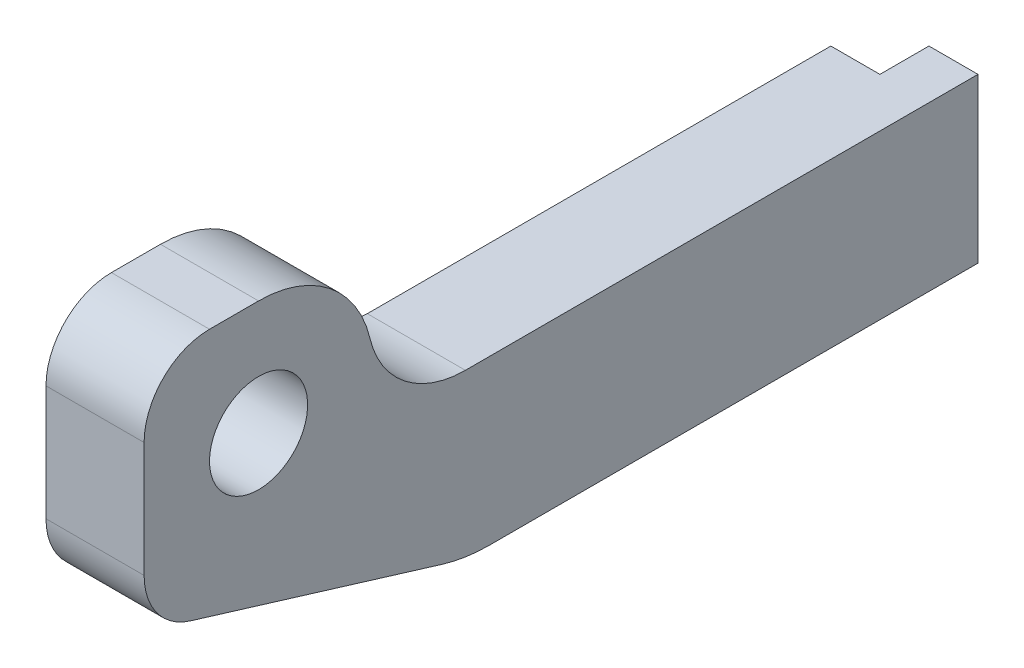
ISO-10303-21;
HEADER;
FILE_DESCRIPTION(('STEP AP214'),'2;1');
FILE_NAME('part.step','',(''),(''),'','','');
FILE_SCHEMA(('AUTOMOTIVE_DESIGN { 1 0 10303 214 1 1 1 1 }'));
ENDSEC;
DATA;
#1=APPLICATION_CONTEXT('core data for automotive mechanical design processes');
#2=APPLICATION_PROTOCOL_DEFINITION('international standard','automotive_design',2000,#1);
#3=PRODUCT_CONTEXT('',#1,'mechanical');
#4=PRODUCT('Part','Part','',(#3));
#5=PRODUCT_RELATED_PRODUCT_CATEGORY('part','',(#4));
#6=PRODUCT_DEFINITION_FORMATION('','',#4);
#7=PRODUCT_DEFINITION_CONTEXT('part definition',#1,'design');
#8=PRODUCT_DEFINITION('design','',#6,#7);
#9=PRODUCT_DEFINITION_SHAPE('','',#8);
#10=(LENGTH_UNIT() NAMED_UNIT(*) SI_UNIT(.MILLI.,.METRE.));
#11=(NAMED_UNIT(*) PLANE_ANGLE_UNIT() SI_UNIT($,.RADIAN.));
#12=(NAMED_UNIT(*) SI_UNIT($,.STERADIAN.) SOLID_ANGLE_UNIT());
#13=UNCERTAINTY_MEASURE_WITH_UNIT(LENGTH_MEASURE(1.E-05),#10,'distance_accuracy_value','');
#14=(GEOMETRIC_REPRESENTATION_CONTEXT(3) GLOBAL_UNCERTAINTY_ASSIGNED_CONTEXT((#13)) GLOBAL_UNIT_ASSIGNED_CONTEXT((#10,
#11,#12)) REPRESENTATION_CONTEXT('',''));
#15=CARTESIAN_POINT('',(0.,0.,0.));
#16=DIRECTION('',(0.,0.,1.));
#17=DIRECTION('',(1.,0.,0.));
#18=AXIS2_PLACEMENT_3D('',#15,#16,#17);
#19=CARTESIAN_POINT('',(-4.,111.5,-23.8150000000001));
#20=DIRECTION('',(-1.,0.,0.));
#21=DIRECTION('',(0.,0.,1.));
#22=AXIS2_PLACEMENT_3D('',#19,#20,#21);
#23=PLANE('',#22);
#24=DIRECTION('',(0.,0.,1.));
#25=VECTOR('',#24,1.);
#26=CARTESIAN_POINT('',(-4.,111.5,-23.8150000000001));
#27=LINE('',#26,#25);
#28=CARTESIAN_POINT('',(-4.,111.5,-23.8150000000001));
#29=VERTEX_POINT('',#28);
#30=CARTESIAN_POINT('',(-4.,111.5,-10.3859376049756));
#31=VERTEX_POINT('',#30);
#32=EDGE_CURVE('E183',#29,#31,#27,.T.);
#33=ORIENTED_EDGE('',*,*,#32,.T.);
#34=CARTESIAN_POINT('',(-4.,116.5,-10.3859376049756));
#35=DIRECTION('',(-1.,0.,0.));
#36=DIRECTION('',(0.,0.,1.));
#37=AXIS2_PLACEMENT_3D('',#34,#35,#36);
#38=CIRCLE('',#37,5.);
#39=CARTESIAN_POINT('',(-4.,111.717977316976,-8.92571191726682));
#40=VERTEX_POINT('',#39);
#41=EDGE_CURVE('E11',#31,#40,#38,.T.);
#42=ORIENTED_EDGE('',*,*,#41,.T.);
#43=DIRECTION('',(0.,0.292045137541756,0.956404536604787));
#44=VECTOR('',#43,1.);
#45=CARTESIAN_POINT('',(-4.,111.5,-9.63955532033681));
#46=LINE('',#45,#44);
#47=CARTESIAN_POINT('',(-4.,114.067641584148,-1.23090972491653));
#48=VERTEX_POINT('',#47);
#49=EDGE_CURVE('E253',#40,#48,#46,.T.);
#50=ORIENTED_EDGE('',*,*,#49,.T.);
#51=CARTESIAN_POINT('',(-4.,115.980450657358,-1.81500000000004));
#52=DIRECTION('',(-1.,0.,0.));
#53=DIRECTION('',(0.,0.,1.));
#54=AXIS2_PLACEMENT_3D('',#51,#52,#53);
#55=CIRCLE('',#54,2.);
#56=CARTESIAN_POINT('',(-4.,115.980450657358,0.184999999999962));
#57=VERTEX_POINT('',#56);
#58=EDGE_CURVE('E145',#48,#57,#55,.T.);
#59=ORIENTED_EDGE('',*,*,#58,.T.);
#60=DIRECTION('',(0.,1.,0.));
#61=VECTOR('',#60,1.);
#62=CARTESIAN_POINT('',(-4.,115.980450657358,0.18499999999996));
#63=LINE('',#62,#61);
#64=CARTESIAN_POINT('',(-4.,119.5,0.18499999999996));
#65=VERTEX_POINT('',#64);
#66=EDGE_CURVE('E249',#57,#65,#63,.T.);
#67=ORIENTED_EDGE('',*,*,#66,.T.);
#68=CARTESIAN_POINT('',(-4.,119.5,-1.81500000000004));
#69=DIRECTION('',(-1.,0.,0.));
#70=DIRECTION('',(0.,0.,1.));
#71=AXIS2_PLACEMENT_3D('',#68,#69,#70);
#72=CIRCLE('',#71,2.);
#73=CARTESIAN_POINT('',(-4.,121.5,-1.81500000000004));
#74=VERTEX_POINT('',#73);
#75=EDGE_CURVE('E246',#65,#74,#72,.T.);
#76=ORIENTED_EDGE('',*,*,#75,.T.);
#77=DIRECTION('',(0.,0.,-1.));
#78=VECTOR('',#77,1.);
#79=CARTESIAN_POINT('',(-4.,121.5,-1.81500000000004));
#80=LINE('',#79,#78);
#81=CARTESIAN_POINT('',(-4.,121.5,-3.31500000000004));
#82=VERTEX_POINT('',#81);
#83=EDGE_CURVE('E242',#74,#82,#80,.T.);
#84=ORIENTED_EDGE('',*,*,#83,.T.);
#85=CARTESIAN_POINT('',(-4.,118.,-3.31500000000004));
#86=DIRECTION('',(-1.,0.,0.));
#87=DIRECTION('',(0.,0.,1.));
#88=AXIS2_PLACEMENT_3D('',#85,#86,#87);
#89=CIRCLE('',#88,3.5);
#90=CARTESIAN_POINT('',(-4.,118.807692307692,-6.72052978787368));
#91=VERTEX_POINT('',#90);
#92=EDGE_CURVE('E240',#82,#91,#89,.T.);
#93=ORIENTED_EDGE('',*,*,#92,.T.);
#94=CARTESIAN_POINT('',(-4.,119.5,-9.6395553203368));
#95=DIRECTION('',(-1.,0.,0.));
#96=DIRECTION('',(0.,0.,1.));
#97=AXIS2_PLACEMENT_3D('',#94,#95,#96);
#98=CIRCLE('',#97,3.);
#99=CARTESIAN_POINT('',(-4.,116.5,-9.6395553203368));
#100=VERTEX_POINT('',#99);
#101=EDGE_CURVE('E182',#91,#100,#98,.F.);
#102=ORIENTED_EDGE('',*,*,#101,.T.);
#103=DIRECTION('',(0.,0.,1.));
#104=VECTOR('',#103,1.);
#105=CARTESIAN_POINT('',(-4.,116.5,-23.8150000000001));
#106=LINE('',#105,#104);
#107=CARTESIAN_POINT('',(-4.,116.5,-23.8150000000001));
#108=VERTEX_POINT('',#107);
#109=EDGE_CURVE('E146',#108,#100,#106,.T.);
#110=ORIENTED_EDGE('',*,*,#109,.F.);
#111=DIRECTION('',(0.,1.,0.));
#112=VECTOR('',#111,1.);
#113=CARTESIAN_POINT('',(-4.,111.5,-23.8150000000001));
#114=LINE('',#113,#112);
#115=EDGE_CURVE('E212',#29,#108,#114,.T.);
#116=ORIENTED_EDGE('',*,*,#115,.F.);
#117=EDGE_LOOP('',(#33,#42,#50,#59,#67,#76,#84,#93,#102,#110,#116));
#118=FACE_BOUND('',#117,.T.);
#119=CARTESIAN_POINT('',(-4.,118.,-3.31500000000004));
#120=DIRECTION('',(-1.,0.,0.));
#121=DIRECTION('',(0.,0.,1.));
#122=AXIS2_PLACEMENT_3D('',#119,#120,#121);
#123=CIRCLE('',#122,1.5);
#124=CARTESIAN_POINT('',(-4.,118.,-1.81500000000004));
#125=VERTEX_POINT('',#124);
#126=EDGE_CURVE('E179',#125,#125,#123,.T.);
#127=ORIENTED_EDGE('',*,*,#126,.F.);
#128=EDGE_LOOP('',(#127));
#129=FACE_BOUND('',#128,.T.);
#130=ADVANCED_FACE('F33',(#118,#129),#23,.T.);
#131=CARTESIAN_POINT('',(-4.,111.5,-23.8150000000001));
#132=DIRECTION('',(0.,0.,-1.));
#133=DIRECTION('',(0.,1.,0.));
#134=AXIS2_PLACEMENT_3D('',#131,#132,#133);
#135=PLANE('',#134);
#136=DIRECTION('',(-1.,0.,0.));
#137=VECTOR('',#136,1.);
#138=CARTESIAN_POINT('',(-4.,116.5,-23.8150000000001));
#139=LINE('',#138,#137);
#140=CARTESIAN_POINT('',(-2.5,116.5,-23.8150000000001));
#141=VERTEX_POINT('',#140);
#142=EDGE_CURVE('E186',#141,#108,#139,.T.);
#143=ORIENTED_EDGE('',*,*,#142,.F.);
#144=DIRECTION('',(0.,1.,0.));
#145=VECTOR('',#144,1.);
#146=CARTESIAN_POINT('',(-2.5,111.5,-23.8150000000001));
#147=LINE('',#146,#145);
#148=CARTESIAN_POINT('',(-2.5,111.5,-23.8150000000001));
#149=VERTEX_POINT('',#148);
#150=EDGE_CURVE('E214',#149,#141,#147,.T.);
#151=ORIENTED_EDGE('',*,*,#150,.F.);
#152=DIRECTION('',(-1.,0.,0.));
#153=VECTOR('',#152,1.);
#154=CARTESIAN_POINT('',(-4.,111.5,-23.8150000000001));
#155=LINE('',#154,#153);
#156=EDGE_CURVE('E194',#149,#29,#155,.T.);
#157=ORIENTED_EDGE('',*,*,#156,.T.);
#158=ORIENTED_EDGE('',*,*,#115,.T.);
#159=EDGE_LOOP('',(#143,#151,#157,#158));
#160=FACE_BOUND('',#159,.T.);
#161=ADVANCED_FACE('F263',(#160),#135,.T.);
#162=CARTESIAN_POINT('',(-2.5,111.5,-23.8150000000001));
#163=DIRECTION('',(-1.,0.,0.));
#164=DIRECTION('',(0.,0.,1.));
#165=AXIS2_PLACEMENT_3D('',#162,#163,#164);
#166=PLANE('',#165);
#167=DIRECTION('',(0.,0.,1.));
#168=VECTOR('',#167,1.);
#169=CARTESIAN_POINT('',(-2.5,116.5,-23.8150000000001));
#170=LINE('',#169,#168);
#171=CARTESIAN_POINT('',(-2.5,116.5,-25.3150000000001));
#172=VERTEX_POINT('',#171);
#173=EDGE_CURVE('E207',#172,#141,#170,.T.);
#174=ORIENTED_EDGE('',*,*,#173,.F.);
#175=DIRECTION('',(0.,1.,0.));
#176=VECTOR('',#175,1.);
#177=CARTESIAN_POINT('',(-2.5,111.5,-25.3150000000001));
#178=LINE('',#177,#176);
#179=CARTESIAN_POINT('',(-2.5,111.5,-25.3150000000001));
#180=VERTEX_POINT('',#179);
#181=EDGE_CURVE('E216',#180,#172,#178,.T.);
#182=ORIENTED_EDGE('',*,*,#181,.F.);
#183=DIRECTION('',(0.,0.,1.));
#184=VECTOR('',#183,1.);
#185=CARTESIAN_POINT('',(-2.5,111.5,-23.8150000000001));
#186=LINE('',#185,#184);
#187=EDGE_CURVE('E191',#180,#149,#186,.T.);
#188=ORIENTED_EDGE('',*,*,#187,.T.);
#189=ORIENTED_EDGE('',*,*,#150,.T.);
#190=EDGE_LOOP('',(#174,#182,#188,#189));
#191=FACE_BOUND('',#190,.T.);
#192=ADVANCED_FACE('F267',(#191),#166,.T.);
#193=CARTESIAN_POINT('',(-2.5,111.5,-25.3150000000001));
#194=DIRECTION('',(0.,0.,-1.));
#195=DIRECTION('',(0.,1.,0.));
#196=AXIS2_PLACEMENT_3D('',#193,#194,#195);
#197=PLANE('',#196);
#198=DIRECTION('',(-1.,0.,0.));
#199=VECTOR('',#198,1.);
#200=CARTESIAN_POINT('',(-2.5,116.5,-25.3150000000001));
#201=LINE('',#200,#199);
#202=CARTESIAN_POINT('',(-1.,116.5,-25.3150000000001));
#203=VERTEX_POINT('',#202);
#204=EDGE_CURVE('E204',#203,#172,#201,.T.);
#205=ORIENTED_EDGE('',*,*,#204,.F.);
#206=DIRECTION('',(0.,1.,0.));
#207=VECTOR('',#206,1.);
#208=CARTESIAN_POINT('',(-1.,111.5,-25.3150000000001));
#209=LINE('',#208,#207);
#210=CARTESIAN_POINT('',(-1.,111.5,-25.3150000000001));
#211=VERTEX_POINT('',#210);
#212=EDGE_CURVE('E197',#211,#203,#209,.T.);
#213=ORIENTED_EDGE('',*,*,#212,.F.);
#214=DIRECTION('',(-1.,0.,0.));
#215=VECTOR('',#214,1.);
#216=CARTESIAN_POINT('',(-2.5,111.5,-25.3150000000001));
#217=LINE('',#216,#215);
#218=EDGE_CURVE('E188',#211,#180,#217,.T.);
#219=ORIENTED_EDGE('',*,*,#218,.T.);
#220=ORIENTED_EDGE('',*,*,#181,.T.);
#221=EDGE_LOOP('',(#205,#213,#219,#220));
#222=FACE_BOUND('',#221,.T.);
#223=ADVANCED_FACE('F226',(#222),#197,.T.);
#224=CARTESIAN_POINT('',(-1.,111.5,-25.3150000000001));
#225=DIRECTION('',(1.,0.,0.));
#226=DIRECTION('',(0.,0.,-1.));
#227=AXIS2_PLACEMENT_3D('',#224,#225,#226);
#228=PLANE('',#227);
#229=DIRECTION('',(0.,0.292045137541756,0.956404536604787));
#230=VECTOR('',#229,1.);
#231=CARTESIAN_POINT('',(-1.,111.5,-9.6395553203368));
#232=LINE('',#231,#230);
#233=CARTESIAN_POINT('',(-1.,111.717977316976,-8.92571191726682));
#234=VERTEX_POINT('',#233);
#235=CARTESIAN_POINT('',(-1.,114.067641584148,-1.23090972491653));
#236=VERTEX_POINT('',#235);
#237=EDGE_CURVE('E127',#234,#236,#232,.T.);
#238=ORIENTED_EDGE('',*,*,#237,.F.);
#239=CARTESIAN_POINT('',(-1.,116.5,-10.3859376049756));
#240=DIRECTION('',(1.,0.,0.));
#241=DIRECTION('',(0.,0.,-1.));
#242=AXIS2_PLACEMENT_3D('',#239,#240,#241);
#243=CIRCLE('',#242,5.);
#244=CARTESIAN_POINT('',(-1.,111.5,-10.3859376049756));
#245=VERTEX_POINT('',#244);
#246=EDGE_CURVE('E55',#234,#245,#243,.T.);
#247=ORIENTED_EDGE('',*,*,#246,.T.);
#248=DIRECTION('',(0.,0.,-1.));
#249=VECTOR('',#248,1.);
#250=CARTESIAN_POINT('',(-1.,111.5,-25.3150000000001));
#251=LINE('',#250,#249);
#252=EDGE_CURVE('E185',#245,#211,#251,.T.);
#253=ORIENTED_EDGE('',*,*,#252,.T.);
#254=ORIENTED_EDGE('',*,*,#212,.T.);
#255=DIRECTION('',(0.,0.,-1.));
#256=VECTOR('',#255,1.);
#257=CARTESIAN_POINT('',(-1.,116.5,-25.3150000000001));
#258=LINE('',#257,#256);
#259=CARTESIAN_POINT('',(-1.,116.5,-9.6395553203368));
#260=VERTEX_POINT('',#259);
#261=EDGE_CURVE('E201',#260,#203,#258,.T.);
#262=ORIENTED_EDGE('',*,*,#261,.F.);
#263=CARTESIAN_POINT('',(-1.,119.5,-9.6395553203368));
#264=DIRECTION('',(1.,0.,0.));
#265=DIRECTION('',(0.,0.,1.));
#266=AXIS2_PLACEMENT_3D('',#263,#264,#265);
#267=CIRCLE('',#266,3.);
#268=CARTESIAN_POINT('',(-1.,118.807692307692,-6.72052978787368));
#269=VERTEX_POINT('',#268);
#270=EDGE_CURVE('E167',#269,#260,#267,.T.);
#271=ORIENTED_EDGE('',*,*,#270,.F.);
#272=CARTESIAN_POINT('',(-1.,118.,-3.31500000000004));
#273=DIRECTION('',(-1.,0.,0.));
#274=DIRECTION('',(0.,0.,1.));
#275=AXIS2_PLACEMENT_3D('',#272,#273,#274);
#276=CIRCLE('',#275,3.5);
#277=CARTESIAN_POINT('',(-1.,121.5,-3.31500000000004));
#278=VERTEX_POINT('',#277);
#279=EDGE_CURVE('E164',#278,#269,#276,.T.);
#280=ORIENTED_EDGE('',*,*,#279,.F.);
#281=DIRECTION('',(0.,0.,-1.));
#282=VECTOR('',#281,1.);
#283=CARTESIAN_POINT('',(-1.,121.5,-1.81500000000004));
#284=LINE('',#283,#282);
#285=CARTESIAN_POINT('',(-1.,121.5,-1.81500000000004));
#286=VERTEX_POINT('',#285);
#287=EDGE_CURVE('E161',#286,#278,#284,.T.);
#288=ORIENTED_EDGE('',*,*,#287,.F.);
#289=CARTESIAN_POINT('',(-1.,119.5,-1.81500000000004));
#290=DIRECTION('',(-1.,0.,0.));
#291=DIRECTION('',(0.,0.,1.));
#292=AXIS2_PLACEMENT_3D('',#289,#290,#291);
#293=CIRCLE('',#292,2.);
#294=CARTESIAN_POINT('',(-1.,119.5,0.18499999999996));
#295=VERTEX_POINT('',#294);
#296=EDGE_CURVE('E155',#295,#286,#293,.T.);
#297=ORIENTED_EDGE('',*,*,#296,.F.);
#298=DIRECTION('',(0.,1.,0.));
#299=VECTOR('',#298,1.);
#300=CARTESIAN_POINT('',(-1.,115.980450657358,0.18499999999996));
#301=LINE('',#300,#299);
#302=CARTESIAN_POINT('',(-1.,115.980450657358,0.184999999999962));
#303=VERTEX_POINT('',#302);
#304=EDGE_CURVE('E153',#303,#295,#301,.T.);
#305=ORIENTED_EDGE('',*,*,#304,.F.);
#306=CARTESIAN_POINT('',(-1.,115.980450657358,-1.81500000000004));
#307=DIRECTION('',(-1.,0.,0.));
#308=DIRECTION('',(0.,0.,1.));
#309=AXIS2_PLACEMENT_3D('',#306,#307,#308);
#310=CIRCLE('',#309,2.);
#311=EDGE_CURVE('E135',#236,#303,#310,.T.);
#312=ORIENTED_EDGE('',*,*,#311,.F.);
#313=EDGE_LOOP('',(#238,#247,#253,#254,#262,#271,#280,#288,#297,#305,#312));
#314=FACE_BOUND('',#313,.T.);
#315=CARTESIAN_POINT('',(-1.,118.,-3.31500000000004));
#316=DIRECTION('',(-1.,0.,0.));
#317=DIRECTION('',(0.,0.,1.));
#318=AXIS2_PLACEMENT_3D('',#315,#316,#317);
#319=CIRCLE('',#318,1.5);
#320=CARTESIAN_POINT('',(-1.,118.,-1.81500000000004));
#321=VERTEX_POINT('',#320);
#322=EDGE_CURVE('E136',#321,#321,#319,.T.);
#323=ORIENTED_EDGE('',*,*,#322,.T.);
#324=EDGE_LOOP('',(#323));
#325=FACE_BOUND('',#324,.T.);
#326=ADVANCED_FACE('F149',(#314,#325),#228,.T.);
#327=CARTESIAN_POINT('',(0.,111.5,0.));
#328=DIRECTION('',(0.,1.,0.));
#329=DIRECTION('',(0.,0.,1.));
#330=AXIS2_PLACEMENT_3D('',#327,#328,#329);
#331=PLANE('',#330);
#332=ORIENTED_EDGE('',*,*,#252,.F.);
#333=DIRECTION('',(1.,0.,0.));
#334=VECTOR('',#333,1.);
#335=CARTESIAN_POINT('',(0.,111.5,-10.3859376049756));
#336=LINE('',#335,#334);
#337=EDGE_CURVE('E41',#245,#31,#336,.F.);
#338=ORIENTED_EDGE('',*,*,#337,.T.);
#339=ORIENTED_EDGE('',*,*,#32,.F.);
#340=ORIENTED_EDGE('',*,*,#156,.F.);
#341=ORIENTED_EDGE('',*,*,#187,.F.);
#342=ORIENTED_EDGE('',*,*,#218,.F.);
#343=EDGE_LOOP('',(#332,#338,#339,#340,#341,#342));
#344=FACE_BOUND('',#343,.T.);
#345=ADVANCED_FACE('F273',(#344),#331,.F.);
#346=CARTESIAN_POINT('',(0.,116.5,0.));
#347=DIRECTION('',(0.,1.,0.));
#348=DIRECTION('',(0.,0.,1.));
#349=AXIS2_PLACEMENT_3D('',#346,#347,#348);
#350=PLANE('',#349);
#351=ORIENTED_EDGE('',*,*,#109,.T.);
#352=DIRECTION('',(1.,0.,0.));
#353=VECTOR('',#352,1.);
#354=CARTESIAN_POINT('',(-4.,116.5,-9.6395553203368));
#355=LINE('',#354,#353);
#356=EDGE_CURVE('E199',#100,#260,#355,.T.);
#357=ORIENTED_EDGE('',*,*,#356,.T.);
#358=ORIENTED_EDGE('',*,*,#261,.T.);
#359=ORIENTED_EDGE('',*,*,#204,.T.);
#360=ORIENTED_EDGE('',*,*,#173,.T.);
#361=ORIENTED_EDGE('',*,*,#142,.T.);
#362=EDGE_LOOP('',(#351,#357,#358,#359,#360,#361));
#363=FACE_BOUND('',#362,.T.);
#364=ADVANCED_FACE('F229',(#363),#350,.T.);
#365=CARTESIAN_POINT('',(-18.0186264392185,119.5,-9.6395553203368));
#366=DIRECTION('',(1.,0.,0.));
#367=DIRECTION('',(0.,0.,-1.));
#368=AXIS2_PLACEMENT_3D('',#365,#366,#367);
#369=CYLINDRICAL_SURFACE('',#368,3.);
#370=ORIENTED_EDGE('',*,*,#101,.F.);
#371=DIRECTION('',(1.,0.,0.));
#372=VECTOR('',#371,1.);
#373=CARTESIAN_POINT('',(-18.0186264392185,118.807692307692,-6.72052978787368));
#374=LINE('',#373,#372);
#375=EDGE_CURVE('E170',#91,#269,#374,.T.);
#376=ORIENTED_EDGE('',*,*,#375,.T.);
#377=ORIENTED_EDGE('',*,*,#270,.T.);
#378=ORIENTED_EDGE('',*,*,#356,.F.);
#379=EDGE_LOOP('',(#370,#376,#377,#378));
#380=FACE_BOUND('',#379,.T.);
#381=ADVANCED_FACE('F235',(#380),#369,.F.);
#382=CARTESIAN_POINT('',(-18.0186264392185,118.,-3.31500000000004));
#383=DIRECTION('',(1.,0.,0.));
#384=DIRECTION('',(0.,0.,-1.));
#385=AXIS2_PLACEMENT_3D('',#382,#383,#384);
#386=CYLINDRICAL_SURFACE('',#385,3.5);
#387=ORIENTED_EDGE('',*,*,#92,.F.);
#388=DIRECTION('',(1.,0.,0.));
#389=VECTOR('',#388,1.);
#390=CARTESIAN_POINT('',(-18.0186264392185,121.5,-3.31500000000004));
#391=LINE('',#390,#389);
#392=EDGE_CURVE('E172',#82,#278,#391,.T.);
#393=ORIENTED_EDGE('',*,*,#392,.T.);
#394=ORIENTED_EDGE('',*,*,#279,.T.);
#395=ORIENTED_EDGE('',*,*,#375,.F.);
#396=EDGE_LOOP('',(#387,#393,#394,#395));
#397=FACE_BOUND('',#396,.T.);
#398=ADVANCED_FACE('F298',(#397),#386,.T.);
#399=CARTESIAN_POINT('',(-18.0186264392185,121.5,-1.81500000000004));
#400=DIRECTION('',(0.,-1.,0.));
#401=DIRECTION('',(0.,0.,-1.));
#402=AXIS2_PLACEMENT_3D('',#399,#400,#401);
#403=PLANE('',#402);
#404=ORIENTED_EDGE('',*,*,#83,.F.);
#405=DIRECTION('',(1.,0.,0.));
#406=VECTOR('',#405,1.);
#407=CARTESIAN_POINT('',(-18.0186264392185,121.5,-1.81500000000004));
#408=LINE('',#407,#406);
#409=EDGE_CURVE('E174',#74,#286,#408,.T.);
#410=ORIENTED_EDGE('',*,*,#409,.T.);
#411=ORIENTED_EDGE('',*,*,#287,.T.);
#412=ORIENTED_EDGE('',*,*,#392,.F.);
#413=EDGE_LOOP('',(#404,#410,#411,#412));
#414=FACE_BOUND('',#413,.T.);
#415=ADVANCED_FACE('F294',(#414),#403,.F.);
#416=CARTESIAN_POINT('',(-18.0186264392185,119.5,-1.81500000000004));
#417=DIRECTION('',(1.,0.,0.));
#418=DIRECTION('',(0.,0.,-1.));
#419=AXIS2_PLACEMENT_3D('',#416,#417,#418);
#420=CYLINDRICAL_SURFACE('',#419,2.);
#421=ORIENTED_EDGE('',*,*,#75,.F.);
#422=DIRECTION('',(1.,0.,0.));
#423=VECTOR('',#422,1.);
#424=CARTESIAN_POINT('',(-18.0186264392185,119.5,0.18499999999996));
#425=LINE('',#424,#423);
#426=EDGE_CURVE('E176',#65,#295,#425,.T.);
#427=ORIENTED_EDGE('',*,*,#426,.T.);
#428=ORIENTED_EDGE('',*,*,#296,.T.);
#429=ORIENTED_EDGE('',*,*,#409,.F.);
#430=EDGE_LOOP('',(#421,#427,#428,#429));
#431=FACE_BOUND('',#430,.T.);
#432=ADVANCED_FACE('F290',(#431),#420,.T.);
#433=CARTESIAN_POINT('',(-18.0186264392185,115.980450657358,0.18499999999996));
#434=DIRECTION('',(0.,0.,-1.));
#435=DIRECTION('',(-1.,0.,0.));
#436=AXIS2_PLACEMENT_3D('',#433,#434,#435);
#437=PLANE('',#436);
#438=ORIENTED_EDGE('',*,*,#66,.F.);
#439=DIRECTION('',(1.,0.,0.));
#440=VECTOR('',#439,1.);
#441=CARTESIAN_POINT('',(-18.0186264392185,115.980450657358,0.184999999999962));
#442=LINE('',#441,#440);
#443=EDGE_CURVE('E147',#57,#303,#442,.T.);
#444=ORIENTED_EDGE('',*,*,#443,.T.);
#445=ORIENTED_EDGE('',*,*,#304,.T.);
#446=ORIENTED_EDGE('',*,*,#426,.F.);
#447=EDGE_LOOP('',(#438,#444,#445,#446));
#448=FACE_BOUND('',#447,.T.);
#449=ADVANCED_FACE('F287',(#448),#437,.F.);
#450=CARTESIAN_POINT('',(-18.0186264392185,115.980450657358,-1.81500000000004));
#451=DIRECTION('',(1.,0.,0.));
#452=DIRECTION('',(0.,0.,-1.));
#453=AXIS2_PLACEMENT_3D('',#450,#451,#452);
#454=CYLINDRICAL_SURFACE('',#453,2.);
#455=ORIENTED_EDGE('',*,*,#58,.F.);
#456=DIRECTION('',(1.,0.,0.));
#457=VECTOR('',#456,1.);
#458=CARTESIAN_POINT('',(-18.0186264392185,114.067641584148,-1.23090972491653));
#459=LINE('',#458,#457);
#460=EDGE_CURVE('E131',#48,#236,#459,.T.);
#461=ORIENTED_EDGE('',*,*,#460,.T.);
#462=ORIENTED_EDGE('',*,*,#311,.T.);
#463=ORIENTED_EDGE('',*,*,#443,.F.);
#464=EDGE_LOOP('',(#455,#461,#462,#463));
#465=FACE_BOUND('',#464,.T.);
#466=ADVANCED_FACE('F141',(#465),#454,.T.);
#467=CARTESIAN_POINT('',(-18.0186264392185,111.5,-9.6395553203368));
#468=DIRECTION('',(0.,0.956404536604787,-0.292045137541756));
#469=DIRECTION('',(0.,0.292045137541756,0.956404536604787));
#470=AXIS2_PLACEMENT_3D('',#467,#468,#469);
#471=PLANE('',#470);
#472=ORIENTED_EDGE('',*,*,#49,.F.);
#473=DIRECTION('',(1.,0.,0.));
#474=VECTOR('',#473,1.);
#475=CARTESIAN_POINT('',(-18.0186264392185,111.717977316976,-8.92571191726682));
#476=LINE('',#475,#474);
#477=EDGE_CURVE('E133',#40,#234,#476,.T.);
#478=ORIENTED_EDGE('',*,*,#477,.T.);
#479=ORIENTED_EDGE('',*,*,#237,.T.);
#480=ORIENTED_EDGE('',*,*,#460,.F.);
#481=EDGE_LOOP('',(#472,#478,#479,#480));
#482=FACE_BOUND('',#481,.T.);
#483=ADVANCED_FACE('F130',(#482),#471,.F.);
#484=CARTESIAN_POINT('',(-18.0186264392185,118.,-3.31500000000004));
#485=DIRECTION('',(1.,0.,0.));
#486=DIRECTION('',(0.,0.,-1.));
#487=AXIS2_PLACEMENT_3D('',#484,#485,#486);
#488=CYLINDRICAL_SURFACE('',#487,1.5);
#489=ORIENTED_EDGE('',*,*,#322,.F.);
#490=EDGE_LOOP('',(#489));
#491=FACE_BOUND('',#490,.T.);
#492=ORIENTED_EDGE('',*,*,#126,.T.);
#493=EDGE_LOOP('',(#492));
#494=FACE_BOUND('',#493,.T.);
#495=ADVANCED_FACE('F257',(#491,#494),#488,.F.);
#496=CARTESIAN_POINT('',(-18.0186264392185,116.5,-10.3859376049756));
#497=DIRECTION('',(1.,0.,0.));
#498=DIRECTION('',(0.,0.,-1.));
#499=AXIS2_PLACEMENT_3D('',#496,#497,#498);
#500=CYLINDRICAL_SURFACE('',#499,5.);
#501=ORIENTED_EDGE('',*,*,#41,.F.);
#502=ORIENTED_EDGE('',*,*,#337,.F.);
#503=ORIENTED_EDGE('',*,*,#246,.F.);
#504=ORIENTED_EDGE('',*,*,#477,.F.);
#505=EDGE_LOOP('',(#501,#502,#503,#504));
#506=FACE_BOUND('',#505,.T.);
#507=ADVANCED_FACE('F35',(#506),#500,.T.);
#508=CLOSED_SHELL('',(#130,#161,#192,#223,#326,#345,#364,#381,#398,#415,#432,#449,#466,#483,
#495,#507));
#509=MANIFOLD_SOLID_BREP('B2',#508);
#510=ADVANCED_BREP_SHAPE_REPRESENTATION('',(#18,#509),#14);
#511=SHAPE_DEFINITION_REPRESENTATION(#9,#510);
ENDSEC;
END-ISO-10303-21;
